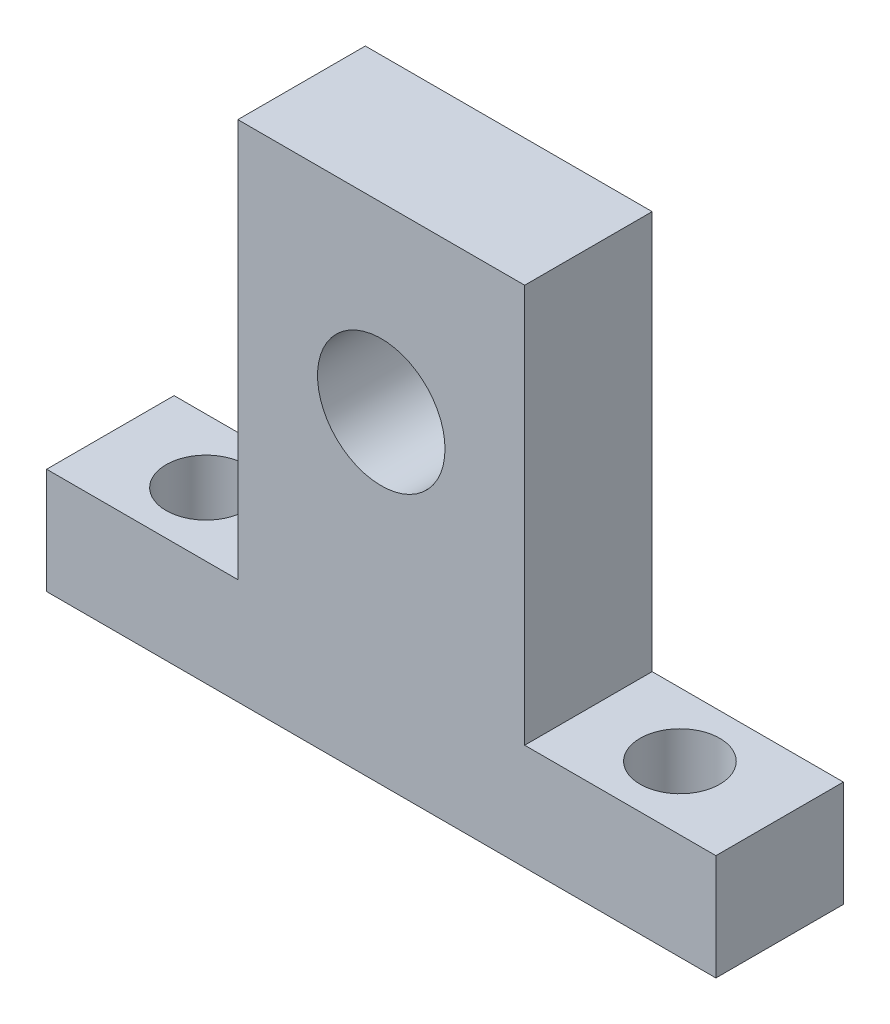
ISO-10303-21;
HEADER;
FILE_DESCRIPTION(('STEP AP214'),'2;1');
FILE_NAME('part.step','',(''),(''),'','','');
FILE_SCHEMA(('AUTOMOTIVE_DESIGN { 1 0 10303 214 1 1 1 1 }'));
ENDSEC;
DATA;
#1=APPLICATION_CONTEXT('core data for automotive mechanical design processes');
#2=APPLICATION_PROTOCOL_DEFINITION('international standard','automotive_design',2000,#1);
#3=PRODUCT_CONTEXT('',#1,'mechanical');
#4=PRODUCT('Part','Part','',(#3));
#5=PRODUCT_RELATED_PRODUCT_CATEGORY('part','',(#4));
#6=PRODUCT_DEFINITION_FORMATION('','',#4);
#7=PRODUCT_DEFINITION_CONTEXT('part definition',#1,'design');
#8=PRODUCT_DEFINITION('design','',#6,#7);
#9=PRODUCT_DEFINITION_SHAPE('','',#8);
#10=(LENGTH_UNIT() NAMED_UNIT(*) SI_UNIT(.MILLI.,.METRE.));
#11=(NAMED_UNIT(*) PLANE_ANGLE_UNIT() SI_UNIT($,.RADIAN.));
#12=(NAMED_UNIT(*) SI_UNIT($,.STERADIAN.) SOLID_ANGLE_UNIT());
#13=UNCERTAINTY_MEASURE_WITH_UNIT(LENGTH_MEASURE(1.E-05),#10,'distance_accuracy_value','');
#14=(GEOMETRIC_REPRESENTATION_CONTEXT(3) GLOBAL_UNCERTAINTY_ASSIGNED_CONTEXT((#13)) GLOBAL_UNIT_ASSIGNED_CONTEXT((#10,
#11,#12)) REPRESENTATION_CONTEXT('',''));
#15=CARTESIAN_POINT('',(0.,0.,0.));
#16=DIRECTION('',(0.,0.,1.));
#17=DIRECTION('',(1.,0.,0.));
#18=AXIS2_PLACEMENT_3D('',#15,#16,#17);
#19=CARTESIAN_POINT('',(0.,0.,8.));
#20=DIRECTION('',(0.,0.,-1.));
#21=DIRECTION('',(-1.,0.,0.));
#22=AXIS2_PLACEMENT_3D('',#19,#20,#21);
#23=PLANE('',#22);
#24=DIRECTION('',(1.,0.,0.));
#25=VECTOR('',#24,1.);
#26=CARTESIAN_POINT('',(9.71414141414143,18.5272727272727,8.));
#27=LINE('',#26,#25);
#28=CARTESIAN_POINT('',(-32.2858585858586,18.5272727272727,8.));
#29=VERTEX_POINT('',#28);
#30=CARTESIAN_POINT('',(9.71414141414143,18.5272727272727,8.));
#31=VERTEX_POINT('',#30);
#32=EDGE_CURVE('E145',#29,#31,#27,.T.);
#33=ORIENTED_EDGE('',*,*,#32,.T.);
#34=DIRECTION('',(0.,1.,0.));
#35=VECTOR('',#34,1.);
#36=CARTESIAN_POINT('',(9.71414141414143,25.1772727272727,8.));
#37=LINE('',#36,#35);
#38=CARTESIAN_POINT('',(9.71414141414143,25.1772727272727,8.));
#39=VERTEX_POINT('',#38);
#40=EDGE_CURVE('E93',#31,#39,#37,.T.);
#41=ORIENTED_EDGE('',*,*,#40,.T.);
#42=DIRECTION('',(-1.,0.,0.));
#43=VECTOR('',#42,1.);
#44=CARTESIAN_POINT('',(-2.28585858585857,25.1772727272727,8.));
#45=LINE('',#44,#43);
#46=CARTESIAN_POINT('',(-2.28585858585857,25.1772727272727,8.));
#47=VERTEX_POINT('',#46);
#48=EDGE_CURVE('E160',#39,#47,#45,.T.);
#49=ORIENTED_EDGE('',*,*,#48,.T.);
#50=DIRECTION('',(0.,1.,0.));
#51=VECTOR('',#50,1.);
#52=CARTESIAN_POINT('',(-2.28585858585858,50.1772727272727,8.));
#53=LINE('',#52,#51);
#54=CARTESIAN_POINT('',(-2.28585858585858,50.1772727272727,8.));
#55=VERTEX_POINT('',#54);
#56=EDGE_CURVE('E173',#47,#55,#53,.T.);
#57=ORIENTED_EDGE('',*,*,#56,.T.);
#58=DIRECTION('',(-1.,0.,0.));
#59=VECTOR('',#58,1.);
#60=CARTESIAN_POINT('',(-20.2858585858586,50.1772727272727,8.));
#61=LINE('',#60,#59);
#62=CARTESIAN_POINT('',(-20.2858585858586,50.1772727272727,8.));
#63=VERTEX_POINT('',#62);
#64=EDGE_CURVE('E112',#55,#63,#61,.T.);
#65=ORIENTED_EDGE('',*,*,#64,.T.);
#66=DIRECTION('',(0.,-1.,0.));
#67=VECTOR('',#66,1.);
#68=CARTESIAN_POINT('',(-20.2858585858586,25.1772727272727,8.));
#69=LINE('',#68,#67);
#70=CARTESIAN_POINT('',(-20.2858585858586,25.1772727272727,8.));
#71=VERTEX_POINT('',#70);
#72=EDGE_CURVE('E106',#63,#71,#69,.T.);
#73=ORIENTED_EDGE('',*,*,#72,.T.);
#74=DIRECTION('',(-1.,0.,0.));
#75=VECTOR('',#74,1.);
#76=CARTESIAN_POINT('',(-32.2858585858586,25.1772727272727,8.));
#77=LINE('',#76,#75);
#78=CARTESIAN_POINT('',(-32.2858585858586,25.1772727272727,8.));
#79=VERTEX_POINT('',#78);
#80=EDGE_CURVE('E110',#71,#79,#77,.T.);
#81=ORIENTED_EDGE('',*,*,#80,.T.);
#82=DIRECTION('',(0.,-1.,0.));
#83=VECTOR('',#82,1.);
#84=CARTESIAN_POINT('',(-32.2858585858586,18.5272727272727,8.));
#85=LINE('',#84,#83);
#86=EDGE_CURVE('E50',#79,#29,#85,.T.);
#87=ORIENTED_EDGE('',*,*,#86,.T.);
#88=EDGE_LOOP('',(#33,#41,#49,#57,#65,#73,#81,#87));
#89=FACE_BOUND('',#88,.T.);
#90=CARTESIAN_POINT('',(-11.2858585858586,38.7772727272727,8.));
#91=DIRECTION('',(0.,0.,1.));
#92=DIRECTION('',(1.,0.,0.));
#93=AXIS2_PLACEMENT_3D('',#90,#91,#92);
#94=CIRCLE('',#93,4.);
#95=CARTESIAN_POINT('',(-7.28585858585857,38.7772727272727,8.));
#96=VERTEX_POINT('',#95);
#97=EDGE_CURVE('E134',#96,#96,#94,.T.);
#98=ORIENTED_EDGE('',*,*,#97,.F.);
#99=EDGE_LOOP('',(#98));
#100=FACE_BOUND('',#99,.T.);
#101=ADVANCED_FACE('F33',(#89,#100),#23,.F.);
#102=CARTESIAN_POINT('',(0.,0.,0.));
#103=DIRECTION('',(0.,0.,-1.));
#104=DIRECTION('',(-1.,0.,0.));
#105=AXIS2_PLACEMENT_3D('',#102,#103,#104);
#106=PLANE('',#105);
#107=DIRECTION('',(1.,0.,0.));
#108=VECTOR('',#107,1.);
#109=CARTESIAN_POINT('',(9.71414141414143,18.5272727272727,0.));
#110=LINE('',#109,#108);
#111=CARTESIAN_POINT('',(-32.2858585858586,18.5272727272727,0.));
#112=VERTEX_POINT('',#111);
#113=CARTESIAN_POINT('',(9.71414141414143,18.5272727272727,0.));
#114=VERTEX_POINT('',#113);
#115=EDGE_CURVE('E130',#112,#114,#110,.T.);
#116=ORIENTED_EDGE('',*,*,#115,.F.);
#117=DIRECTION('',(0.,-1.,0.));
#118=VECTOR('',#117,1.);
#119=CARTESIAN_POINT('',(-32.2858585858586,18.5272727272727,0.));
#120=LINE('',#119,#118);
#121=CARTESIAN_POINT('',(-32.2858585858586,25.1772727272727,0.));
#122=VERTEX_POINT('',#121);
#123=EDGE_CURVE('E85',#122,#112,#120,.T.);
#124=ORIENTED_EDGE('',*,*,#123,.F.);
#125=DIRECTION('',(-1.,0.,0.));
#126=VECTOR('',#125,1.);
#127=CARTESIAN_POINT('',(-32.2858585858586,25.1772727272727,0.));
#128=LINE('',#127,#126);
#129=CARTESIAN_POINT('',(-20.2858585858586,25.1772727272727,0.));
#130=VERTEX_POINT('',#129);
#131=EDGE_CURVE('E79',#130,#122,#128,.T.);
#132=ORIENTED_EDGE('',*,*,#131,.F.);
#133=DIRECTION('',(0.,-1.,0.));
#134=VECTOR('',#133,1.);
#135=CARTESIAN_POINT('',(-20.2858585858586,25.1772727272727,0.));
#136=LINE('',#135,#134);
#137=CARTESIAN_POINT('',(-20.2858585858586,50.1772727272727,0.));
#138=VERTEX_POINT('',#137);
#139=EDGE_CURVE('E120',#138,#130,#136,.T.);
#140=ORIENTED_EDGE('',*,*,#139,.F.);
#141=DIRECTION('',(-1.,0.,0.));
#142=VECTOR('',#141,1.);
#143=CARTESIAN_POINT('',(-20.2858585858586,50.1772727272727,0.));
#144=LINE('',#143,#142);
#145=CARTESIAN_POINT('',(-2.28585858585858,50.1772727272727,0.));
#146=VERTEX_POINT('',#145);
#147=EDGE_CURVE('E140',#146,#138,#144,.T.);
#148=ORIENTED_EDGE('',*,*,#147,.F.);
#149=DIRECTION('',(0.,1.,0.));
#150=VECTOR('',#149,1.);
#151=CARTESIAN_POINT('',(-2.28585858585858,50.1772727272727,0.));
#152=LINE('',#151,#150);
#153=CARTESIAN_POINT('',(-2.28585858585857,25.1772727272727,0.));
#154=VERTEX_POINT('',#153);
#155=EDGE_CURVE('E138',#154,#146,#152,.T.);
#156=ORIENTED_EDGE('',*,*,#155,.F.);
#157=DIRECTION('',(-1.,0.,0.));
#158=VECTOR('',#157,1.);
#159=CARTESIAN_POINT('',(-2.28585858585857,25.1772727272727,0.));
#160=LINE('',#159,#158);
#161=CARTESIAN_POINT('',(9.71414141414143,25.1772727272727,0.));
#162=VERTEX_POINT('',#161);
#163=EDGE_CURVE('E136',#162,#154,#160,.T.);
#164=ORIENTED_EDGE('',*,*,#163,.F.);
#165=DIRECTION('',(0.,1.,0.));
#166=VECTOR('',#165,1.);
#167=CARTESIAN_POINT('',(9.71414141414143,25.1772727272727,0.));
#168=LINE('',#167,#166);
#169=EDGE_CURVE('E133',#114,#162,#168,.T.);
#170=ORIENTED_EDGE('',*,*,#169,.F.);
#171=EDGE_LOOP('',(#116,#124,#132,#140,#148,#156,#164,#170));
#172=FACE_BOUND('',#171,.T.);
#173=CARTESIAN_POINT('',(-11.2858585858586,38.7772727272727,0.));
#174=DIRECTION('',(0.,0.,1.));
#175=DIRECTION('',(1.,0.,0.));
#176=AXIS2_PLACEMENT_3D('',#173,#174,#175);
#177=CIRCLE('',#176,4.);
#178=CARTESIAN_POINT('',(-7.28585858585857,38.7772727272727,0.));
#179=VERTEX_POINT('',#178);
#180=EDGE_CURVE('E179',#179,#179,#177,.T.);
#181=ORIENTED_EDGE('',*,*,#180,.T.);
#182=EDGE_LOOP('',(#181));
#183=FACE_BOUND('',#182,.T.);
#184=ADVANCED_FACE('F164',(#172,#183),#106,.T.);
#185=CARTESIAN_POINT('',(9.71414141414143,18.5272727272727,8.));
#186=DIRECTION('',(0.,1.,0.));
#187=DIRECTION('',(-1.,0.,0.));
#188=AXIS2_PLACEMENT_3D('',#185,#186,#187);
#189=PLANE('',#188);
#190=CARTESIAN_POINT('',(-26.2858585858586,18.5272727272727,4.));
#191=DIRECTION('',(0.,1.,0.));
#192=DIRECTION('',(-1.,0.,0.));
#193=AXIS2_PLACEMENT_3D('',#190,#191,#192);
#194=CIRCLE('',#193,2.5);
#195=CARTESIAN_POINT('',(-28.7858585858586,18.5272727272727,4.));
#196=VERTEX_POINT('',#195);
#197=EDGE_CURVE('E182',#196,#196,#194,.F.);
#198=ORIENTED_EDGE('',*,*,#197,.F.);
#199=EDGE_LOOP('',(#198));
#200=FACE_BOUND('',#199,.T.);
#201=CARTESIAN_POINT('',(3.45668568998847,18.5272727272727,4.));
#202=DIRECTION('',(0.,1.,0.));
#203=DIRECTION('',(-1.,0.,0.));
#204=AXIS2_PLACEMENT_3D('',#201,#202,#203);
#205=CIRCLE('',#204,2.5);
#206=CARTESIAN_POINT('',(0.95668568998847,18.5272727272727,4.));
#207=VERTEX_POINT('',#206);
#208=EDGE_CURVE('E185',#207,#207,#205,.F.);
#209=ORIENTED_EDGE('',*,*,#208,.F.);
#210=EDGE_LOOP('',(#209));
#211=FACE_BOUND('',#210,.T.);
#212=ORIENTED_EDGE('',*,*,#115,.T.);
#213=DIRECTION('',(0.,0.,-1.));
#214=VECTOR('',#213,1.);
#215=CARTESIAN_POINT('',(9.71414141414143,18.5272727272727,8.));
#216=LINE('',#215,#214);
#217=EDGE_CURVE('E11',#31,#114,#216,.T.);
#218=ORIENTED_EDGE('',*,*,#217,.F.);
#219=ORIENTED_EDGE('',*,*,#32,.F.);
#220=DIRECTION('',(0.,0.,-1.));
#221=VECTOR('',#220,1.);
#222=CARTESIAN_POINT('',(-32.2858585858586,18.5272727272727,8.));
#223=LINE('',#222,#221);
#224=EDGE_CURVE('E126',#29,#112,#223,.T.);
#225=ORIENTED_EDGE('',*,*,#224,.T.);
#226=EDGE_LOOP('',(#212,#218,#219,#225));
#227=FACE_BOUND('',#226,.T.);
#228=ADVANCED_FACE('F35',(#200,#211,#227),#189,.F.);
#229=CARTESIAN_POINT('',(9.71414141414143,25.1772727272727,8.));
#230=DIRECTION('',(-1.,0.,0.));
#231=DIRECTION('',(0.,0.,1.));
#232=AXIS2_PLACEMENT_3D('',#229,#230,#231);
#233=PLANE('',#232);
#234=ORIENTED_EDGE('',*,*,#169,.T.);
#235=DIRECTION('',(0.,0.,-1.));
#236=VECTOR('',#235,1.);
#237=CARTESIAN_POINT('',(9.71414141414143,25.1772727272727,8.));
#238=LINE('',#237,#236);
#239=EDGE_CURVE('E42',#39,#162,#238,.T.);
#240=ORIENTED_EDGE('',*,*,#239,.F.);
#241=ORIENTED_EDGE('',*,*,#40,.F.);
#242=ORIENTED_EDGE('',*,*,#217,.T.);
#243=EDGE_LOOP('',(#234,#240,#241,#242));
#244=FACE_BOUND('',#243,.T.);
#245=ADVANCED_FACE('F232',(#244),#233,.F.);
#246=CARTESIAN_POINT('',(-2.28585858585857,25.1772727272727,8.));
#247=DIRECTION('',(0.,-1.,0.));
#248=DIRECTION('',(1.,0.,0.));
#249=AXIS2_PLACEMENT_3D('',#246,#247,#248);
#250=PLANE('',#249);
#251=CARTESIAN_POINT('',(3.45668568998847,25.1772727272727,4.));
#252=DIRECTION('',(0.,1.,0.));
#253=DIRECTION('',(0.,0.,1.));
#254=AXIS2_PLACEMENT_3D('',#251,#252,#253);
#255=CIRCLE('',#254,2.5);
#256=CARTESIAN_POINT('',(3.45668568998847,25.1772727272727,6.5));
#257=VERTEX_POINT('',#256);
#258=EDGE_CURVE('E189',#257,#257,#255,.T.);
#259=ORIENTED_EDGE('',*,*,#258,.F.);
#260=EDGE_LOOP('',(#259));
#261=FACE_BOUND('',#260,.T.);
#262=ORIENTED_EDGE('',*,*,#163,.T.);
#263=DIRECTION('',(0.,0.,-1.));
#264=VECTOR('',#263,1.);
#265=CARTESIAN_POINT('',(-2.28585858585857,25.1772727272727,8.));
#266=LINE('',#265,#264);
#267=EDGE_CURVE('E152',#47,#154,#266,.T.);
#268=ORIENTED_EDGE('',*,*,#267,.F.);
#269=ORIENTED_EDGE('',*,*,#48,.F.);
#270=ORIENTED_EDGE('',*,*,#239,.T.);
#271=EDGE_LOOP('',(#262,#268,#269,#270));
#272=FACE_BOUND('',#271,.T.);
#273=ADVANCED_FACE('F158',(#261,#272),#250,.F.);
#274=CARTESIAN_POINT('',(-2.28585858585858,50.1772727272727,8.));
#275=DIRECTION('',(-1.,0.,0.));
#276=DIRECTION('',(0.,-1.,0.));
#277=AXIS2_PLACEMENT_3D('',#274,#275,#276);
#278=PLANE('',#277);
#279=ORIENTED_EDGE('',*,*,#155,.T.);
#280=DIRECTION('',(0.,0.,-1.));
#281=VECTOR('',#280,1.);
#282=CARTESIAN_POINT('',(-2.28585858585858,50.1772727272727,8.));
#283=LINE('',#282,#281);
#284=EDGE_CURVE('E149',#55,#146,#283,.T.);
#285=ORIENTED_EDGE('',*,*,#284,.F.);
#286=ORIENTED_EDGE('',*,*,#56,.F.);
#287=ORIENTED_EDGE('',*,*,#267,.T.);
#288=EDGE_LOOP('',(#279,#285,#286,#287));
#289=FACE_BOUND('',#288,.T.);
#290=ADVANCED_FACE('F169',(#289),#278,.F.);
#291=CARTESIAN_POINT('',(-20.2858585858586,50.1772727272727,8.));
#292=DIRECTION('',(0.,-1.,0.));
#293=DIRECTION('',(0.,0.,-1.));
#294=AXIS2_PLACEMENT_3D('',#291,#292,#293);
#295=PLANE('',#294);
#296=ORIENTED_EDGE('',*,*,#147,.T.);
#297=DIRECTION('',(0.,0.,-1.));
#298=VECTOR('',#297,1.);
#299=CARTESIAN_POINT('',(-20.2858585858586,50.1772727272727,8.));
#300=LINE('',#299,#298);
#301=EDGE_CURVE('E121',#63,#138,#300,.T.);
#302=ORIENTED_EDGE('',*,*,#301,.F.);
#303=ORIENTED_EDGE('',*,*,#64,.F.);
#304=ORIENTED_EDGE('',*,*,#284,.T.);
#305=EDGE_LOOP('',(#296,#302,#303,#304));
#306=FACE_BOUND('',#305,.T.);
#307=ADVANCED_FACE('F172',(#306),#295,.F.);
#308=CARTESIAN_POINT('',(-20.2858585858586,25.1772727272727,8.));
#309=DIRECTION('',(1.,0.,0.));
#310=DIRECTION('',(0.,0.,-1.));
#311=AXIS2_PLACEMENT_3D('',#308,#309,#310);
#312=PLANE('',#311);
#313=ORIENTED_EDGE('',*,*,#139,.T.);
#314=DIRECTION('',(0.,0.,-1.));
#315=VECTOR('',#314,1.);
#316=CARTESIAN_POINT('',(-20.2858585858586,25.1772727272727,8.));
#317=LINE('',#316,#315);
#318=EDGE_CURVE('E117',#71,#130,#317,.T.);
#319=ORIENTED_EDGE('',*,*,#318,.F.);
#320=ORIENTED_EDGE('',*,*,#72,.F.);
#321=ORIENTED_EDGE('',*,*,#301,.T.);
#322=EDGE_LOOP('',(#313,#319,#320,#321));
#323=FACE_BOUND('',#322,.T.);
#324=ADVANCED_FACE('F118',(#323),#312,.F.);
#325=CARTESIAN_POINT('',(-32.2858585858586,25.1772727272727,8.));
#326=DIRECTION('',(0.,-1.,0.));
#327=DIRECTION('',(0.,0.,-1.));
#328=AXIS2_PLACEMENT_3D('',#325,#326,#327);
#329=PLANE('',#328);
#330=CARTESIAN_POINT('',(-26.2858585858586,25.1772727272727,4.));
#331=DIRECTION('',(0.,1.,0.));
#332=DIRECTION('',(0.,0.,1.));
#333=AXIS2_PLACEMENT_3D('',#330,#331,#332);
#334=CIRCLE('',#333,2.5);
#335=CARTESIAN_POINT('',(-26.2858585858586,25.1772727272727,6.5));
#336=VERTEX_POINT('',#335);
#337=EDGE_CURVE('E188',#336,#336,#334,.T.);
#338=ORIENTED_EDGE('',*,*,#337,.F.);
#339=EDGE_LOOP('',(#338));
#340=FACE_BOUND('',#339,.T.);
#341=ORIENTED_EDGE('',*,*,#131,.T.);
#342=DIRECTION('',(0.,0.,-1.));
#343=VECTOR('',#342,1.);
#344=CARTESIAN_POINT('',(-32.2858585858586,25.1772727272727,8.));
#345=LINE('',#344,#343);
#346=EDGE_CURVE('E122',#79,#122,#345,.T.);
#347=ORIENTED_EDGE('',*,*,#346,.F.);
#348=ORIENTED_EDGE('',*,*,#80,.F.);
#349=ORIENTED_EDGE('',*,*,#318,.T.);
#350=EDGE_LOOP('',(#341,#347,#348,#349));
#351=FACE_BOUND('',#350,.T.);
#352=ADVANCED_FACE('F124',(#340,#351),#329,.F.);
#353=CARTESIAN_POINT('',(-32.2858585858586,18.5272727272727,8.));
#354=DIRECTION('',(1.,0.,0.));
#355=DIRECTION('',(0.,0.,-1.));
#356=AXIS2_PLACEMENT_3D('',#353,#354,#355);
#357=PLANE('',#356);
#358=ORIENTED_EDGE('',*,*,#123,.T.);
#359=ORIENTED_EDGE('',*,*,#224,.F.);
#360=ORIENTED_EDGE('',*,*,#86,.F.);
#361=ORIENTED_EDGE('',*,*,#346,.T.);
#362=EDGE_LOOP('',(#358,#359,#360,#361));
#363=FACE_BOUND('',#362,.T.);
#364=ADVANCED_FACE('F200',(#363),#357,.F.);
#365=CARTESIAN_POINT('',(-11.2858585858586,38.7772727272727,8.));
#366=DIRECTION('',(0.,0.,-1.));
#367=DIRECTION('',(-1.,0.,0.));
#368=AXIS2_PLACEMENT_3D('',#365,#366,#367);
#369=CYLINDRICAL_SURFACE('',#368,4.);
#370=ORIENTED_EDGE('',*,*,#97,.T.);
#371=EDGE_LOOP('',(#370));
#372=FACE_BOUND('',#371,.T.);
#373=ORIENTED_EDGE('',*,*,#180,.F.);
#374=EDGE_LOOP('',(#373));
#375=FACE_BOUND('',#374,.T.);
#376=ADVANCED_FACE('F207',(#372,#375),#369,.F.);
#377=CARTESIAN_POINT('',(-26.2858585858586,11.4562049154072,4.));
#378=DIRECTION('',(0.,1.,0.));
#379=DIRECTION('',(0.,0.,1.));
#380=AXIS2_PLACEMENT_3D('',#377,#378,#379);
#381=CYLINDRICAL_SURFACE('',#380,2.5);
#382=ORIENTED_EDGE('',*,*,#197,.T.);
#383=EDGE_LOOP('',(#382));
#384=FACE_BOUND('',#383,.T.);
#385=ORIENTED_EDGE('',*,*,#337,.T.);
#386=EDGE_LOOP('',(#385));
#387=FACE_BOUND('',#386,.T.);
#388=ADVANCED_FACE('F197',(#384,#387),#381,.F.);
#389=CARTESIAN_POINT('',(3.45668568998847,11.4562049154072,4.));
#390=DIRECTION('',(0.,1.,0.));
#391=DIRECTION('',(0.,0.,1.));
#392=AXIS2_PLACEMENT_3D('',#389,#390,#391);
#393=CYLINDRICAL_SURFACE('',#392,2.5);
#394=ORIENTED_EDGE('',*,*,#208,.T.);
#395=EDGE_LOOP('',(#394));
#396=FACE_BOUND('',#395,.T.);
#397=ORIENTED_EDGE('',*,*,#258,.T.);
#398=EDGE_LOOP('',(#397));
#399=FACE_BOUND('',#398,.T.);
#400=ADVANCED_FACE('F221',(#396,#399),#393,.F.);
#401=CLOSED_SHELL('',(#101,#184,#228,#245,#273,#290,#307,#324,#352,#364,#376,#388,#400));
#402=MANIFOLD_SOLID_BREP('B2',#401);
#403=ADVANCED_BREP_SHAPE_REPRESENTATION('',(#18,#402),#14);
#404=SHAPE_DEFINITION_REPRESENTATION(#9,#403);
ENDSEC;
END-ISO-10303-21;
